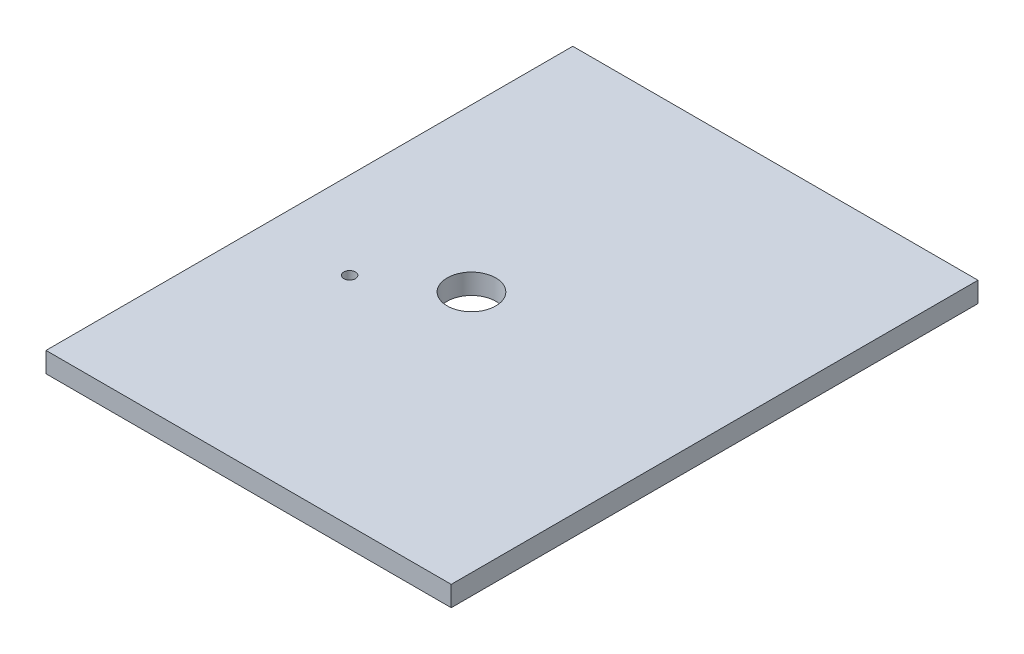
ISO-10303-21;
HEADER;
FILE_DESCRIPTION(('STEP AP214'),'2;1');
FILE_NAME('part.step','',(''),(''),'','','');
FILE_SCHEMA(('AUTOMOTIVE_DESIGN { 1 0 10303 214 1 1 1 1 }'));
ENDSEC;
DATA;
#1=APPLICATION_CONTEXT('core data for automotive mechanical design processes');
#2=APPLICATION_PROTOCOL_DEFINITION('international standard','automotive_design',2000,#1);
#3=PRODUCT_CONTEXT('',#1,'mechanical');
#4=PRODUCT('Part','Part','',(#3));
#5=PRODUCT_RELATED_PRODUCT_CATEGORY('part','',(#4));
#6=PRODUCT_DEFINITION_FORMATION('','',#4);
#7=PRODUCT_DEFINITION_CONTEXT('part definition',#1,'design');
#8=PRODUCT_DEFINITION('design','',#6,#7);
#9=PRODUCT_DEFINITION_SHAPE('','',#8);
#10=(LENGTH_UNIT() NAMED_UNIT(*) SI_UNIT(.MILLI.,.METRE.));
#11=(NAMED_UNIT(*) PLANE_ANGLE_UNIT() SI_UNIT($,.RADIAN.));
#12=(NAMED_UNIT(*) SI_UNIT($,.STERADIAN.) SOLID_ANGLE_UNIT());
#13=UNCERTAINTY_MEASURE_WITH_UNIT(LENGTH_MEASURE(1.E-05),#10,'distance_accuracy_value','');
#14=(GEOMETRIC_REPRESENTATION_CONTEXT(3) GLOBAL_UNCERTAINTY_ASSIGNED_CONTEXT((#13)) GLOBAL_UNIT_ASSIGNED_CONTEXT((#10,
#11,#12)) REPRESENTATION_CONTEXT('',''));
#15=CARTESIAN_POINT('',(0.,0.,0.));
#16=DIRECTION('',(0.,0.,1.));
#17=DIRECTION('',(1.,0.,0.));
#18=AXIS2_PLACEMENT_3D('',#15,#16,#17);
#19=CARTESIAN_POINT('',(0.,5.,0.));
#20=DIRECTION('',(0.,1.,0.));
#21=DIRECTION('',(0.,0.,1.));
#22=AXIS2_PLACEMENT_3D('',#19,#20,#21);
#23=PLANE('',#22);
#24=CARTESIAN_POINT('',(13.3490566037736,5.,-39.6462264150943));
#25=DIRECTION('',(0.,1.,0.));
#26=DIRECTION('',(0.,0.,1.));
#27=AXIS2_PLACEMENT_3D('',#24,#25,#26);
#28=CIRCLE('',#27,6.00000000000001);
#29=CARTESIAN_POINT('',(13.3490566037736,5.,-33.6462264150943));
#30=VERTEX_POINT('',#29);
#31=EDGE_CURVE('E100',#30,#30,#28,.T.);
#32=ORIENTED_EDGE('',*,*,#31,.F.);
#33=EDGE_LOOP('',(#32));
#34=FACE_BOUND('',#33,.T.);
#35=DIRECTION('',(0.,0.,1.));
#36=VECTOR('',#35,1.);
#37=CARTESIAN_POINT('',(-26.6509433962264,5.,-104.646226415094));
#38=LINE('',#37,#36);
#39=CARTESIAN_POINT('',(-26.6509433962264,5.,-104.646226415094));
#40=VERTEX_POINT('',#39);
#41=CARTESIAN_POINT('',(-26.6509433962264,5.,25.3537735849057));
#42=VERTEX_POINT('',#41);
#43=EDGE_CURVE('E85',#40,#42,#38,.T.);
#44=ORIENTED_EDGE('',*,*,#43,.T.);
#45=DIRECTION('',(1.,0.,0.));
#46=VECTOR('',#45,1.);
#47=CARTESIAN_POINT('',(-26.6509433962264,5.,25.3537735849057));
#48=LINE('',#47,#46);
#49=CARTESIAN_POINT('',(73.3490566037736,5.,25.3537735849057));
#50=VERTEX_POINT('',#49);
#51=EDGE_CURVE('E80',#42,#50,#48,.T.);
#52=ORIENTED_EDGE('',*,*,#51,.T.);
#53=DIRECTION('',(0.,0.,-1.));
#54=VECTOR('',#53,1.);
#55=CARTESIAN_POINT('',(73.3490566037736,5.,-104.646226415094));
#56=LINE('',#55,#54);
#57=CARTESIAN_POINT('',(73.3490566037736,5.,-104.646226415094));
#58=VERTEX_POINT('',#57);
#59=EDGE_CURVE('E83',#50,#58,#56,.T.);
#60=ORIENTED_EDGE('',*,*,#59,.T.);
#61=DIRECTION('',(-1.,0.,0.));
#62=VECTOR('',#61,1.);
#63=CARTESIAN_POINT('',(-26.6509433962264,5.,-104.646226415094));
#64=LINE('',#63,#62);
#65=EDGE_CURVE('E50',#58,#40,#64,.T.);
#66=ORIENTED_EDGE('',*,*,#65,.T.);
#67=EDGE_LOOP('',(#44,#52,#60,#66));
#68=FACE_BOUND('',#67,.T.);
#69=CARTESIAN_POINT('',(-5.23521012000572,5.,-28.1656975526831));
#70=DIRECTION('',(0.,1.,0.));
#71=DIRECTION('',(0.,0.,1.));
#72=AXIS2_PLACEMENT_3D('',#69,#70,#71);
#73=CIRCLE('',#72,1.44417410897771);
#74=CARTESIAN_POINT('',(-5.23521012000572,5.,-26.7215234437054));
#75=VERTEX_POINT('',#74);
#76=EDGE_CURVE('E115',#75,#75,#73,.T.);
#77=ORIENTED_EDGE('',*,*,#76,.F.);
#78=EDGE_LOOP('',(#77));
#79=FACE_BOUND('',#78,.T.);
#80=ADVANCED_FACE('F33',(#34,#68,#79),#23,.T.);
#81=CARTESIAN_POINT('',(0.,0.,0.));
#82=DIRECTION('',(0.,1.,0.));
#83=DIRECTION('',(0.,0.,1.));
#84=AXIS2_PLACEMENT_3D('',#81,#82,#83);
#85=PLANE('',#84);
#86=DIRECTION('',(0.,0.,1.));
#87=VECTOR('',#86,1.);
#88=CARTESIAN_POINT('',(-26.6509433962264,0.,-104.646226415094));
#89=LINE('',#88,#87);
#90=CARTESIAN_POINT('',(-26.6509433962264,0.,-104.646226415094));
#91=VERTEX_POINT('',#90);
#92=CARTESIAN_POINT('',(-26.6509433962264,0.,25.3537735849057));
#93=VERTEX_POINT('',#92);
#94=EDGE_CURVE('E97',#91,#93,#89,.T.);
#95=ORIENTED_EDGE('',*,*,#94,.F.);
#96=DIRECTION('',(-1.,0.,0.));
#97=VECTOR('',#96,1.);
#98=CARTESIAN_POINT('',(-26.6509433962264,0.,-104.646226415094));
#99=LINE('',#98,#97);
#100=CARTESIAN_POINT('',(73.3490566037736,0.,-104.646226415094));
#101=VERTEX_POINT('',#100);
#102=EDGE_CURVE('E73',#101,#91,#99,.T.);
#103=ORIENTED_EDGE('',*,*,#102,.F.);
#104=DIRECTION('',(0.,0.,-1.));
#105=VECTOR('',#104,1.);
#106=CARTESIAN_POINT('',(73.3490566037736,0.,-104.646226415094));
#107=LINE('',#106,#105);
#108=CARTESIAN_POINT('',(73.3490566037736,0.,25.3537735849057));
#109=VERTEX_POINT('',#108);
#110=EDGE_CURVE('E67',#109,#101,#107,.T.);
#111=ORIENTED_EDGE('',*,*,#110,.F.);
#112=DIRECTION('',(1.,0.,0.));
#113=VECTOR('',#112,1.);
#114=CARTESIAN_POINT('',(-26.6509433962264,0.,25.3537735849057));
#115=LINE('',#114,#113);
#116=EDGE_CURVE('E89',#93,#109,#115,.T.);
#117=ORIENTED_EDGE('',*,*,#116,.F.);
#118=EDGE_LOOP('',(#95,#103,#111,#117));
#119=FACE_BOUND('',#118,.T.);
#120=CARTESIAN_POINT('',(13.3490566037736,0.,-39.6462264150943));
#121=DIRECTION('',(0.,1.,0.));
#122=DIRECTION('',(0.,0.,1.));
#123=AXIS2_PLACEMENT_3D('',#120,#121,#122);
#124=CIRCLE('',#123,6.00000000000001);
#125=CARTESIAN_POINT('',(13.3490566037736,0.,-33.6462264150943));
#126=VERTEX_POINT('',#125);
#127=EDGE_CURVE('E112',#126,#126,#124,.T.);
#128=ORIENTED_EDGE('',*,*,#127,.T.);
#129=EDGE_LOOP('',(#128));
#130=FACE_BOUND('',#129,.T.);
#131=CARTESIAN_POINT('',(-5.23521012000572,0.,-28.1656975526831));
#132=DIRECTION('',(0.,1.,0.));
#133=DIRECTION('',(0.,0.,1.));
#134=AXIS2_PLACEMENT_3D('',#131,#132,#133);
#135=CIRCLE('',#134,1.44417410897771);
#136=CARTESIAN_POINT('',(-5.23521012000572,0.,-26.7215234437054));
#137=VERTEX_POINT('',#136);
#138=EDGE_CURVE('E118',#137,#137,#135,.T.);
#139=ORIENTED_EDGE('',*,*,#138,.T.);
#140=EDGE_LOOP('',(#139));
#141=FACE_BOUND('',#140,.T.);
#142=ADVANCED_FACE('F108',(#119,#130,#141),#85,.F.);
#143=CARTESIAN_POINT('',(-26.6509433962264,5.,-104.646226415094));
#144=DIRECTION('',(1.,0.,0.));
#145=DIRECTION('',(0.,0.,-1.));
#146=AXIS2_PLACEMENT_3D('',#143,#144,#145);
#147=PLANE('',#146);
#148=ORIENTED_EDGE('',*,*,#94,.T.);
#149=DIRECTION('',(0.,-1.,0.));
#150=VECTOR('',#149,1.);
#151=CARTESIAN_POINT('',(-26.6509433962264,5.,25.3537735849057));
#152=LINE('',#151,#150);
#153=EDGE_CURVE('E11',#42,#93,#152,.T.);
#154=ORIENTED_EDGE('',*,*,#153,.F.);
#155=ORIENTED_EDGE('',*,*,#43,.F.);
#156=DIRECTION('',(0.,-1.,0.));
#157=VECTOR('',#156,1.);
#158=CARTESIAN_POINT('',(-26.6509433962264,5.,-104.646226415094));
#159=LINE('',#158,#157);
#160=EDGE_CURVE('E93',#40,#91,#159,.T.);
#161=ORIENTED_EDGE('',*,*,#160,.T.);
#162=EDGE_LOOP('',(#148,#154,#155,#161));
#163=FACE_BOUND('',#162,.T.);
#164=ADVANCED_FACE('F35',(#163),#147,.F.);
#165=CARTESIAN_POINT('',(-26.6509433962264,5.,25.3537735849057));
#166=DIRECTION('',(0.,0.,-1.));
#167=DIRECTION('',(-1.,0.,0.));
#168=AXIS2_PLACEMENT_3D('',#165,#166,#167);
#169=PLANE('',#168);
#170=ORIENTED_EDGE('',*,*,#116,.T.);
#171=DIRECTION('',(0.,-1.,0.));
#172=VECTOR('',#171,1.);
#173=CARTESIAN_POINT('',(73.3490566037736,5.,25.3537735849057));
#174=LINE('',#173,#172);
#175=EDGE_CURVE('E42',#50,#109,#174,.T.);
#176=ORIENTED_EDGE('',*,*,#175,.F.);
#177=ORIENTED_EDGE('',*,*,#51,.F.);
#178=ORIENTED_EDGE('',*,*,#153,.T.);
#179=EDGE_LOOP('',(#170,#176,#177,#178));
#180=FACE_BOUND('',#179,.T.);
#181=ADVANCED_FACE('F88',(#180),#169,.F.);
#182=CARTESIAN_POINT('',(73.3490566037736,5.,-104.646226415094));
#183=DIRECTION('',(-1.,0.,0.));
#184=DIRECTION('',(0.,0.,1.));
#185=AXIS2_PLACEMENT_3D('',#182,#183,#184);
#186=PLANE('',#185);
#187=ORIENTED_EDGE('',*,*,#110,.T.);
#188=DIRECTION('',(0.,-1.,0.));
#189=VECTOR('',#188,1.);
#190=CARTESIAN_POINT('',(73.3490566037736,5.,-104.646226415094));
#191=LINE('',#190,#189);
#192=EDGE_CURVE('E90',#58,#101,#191,.T.);
#193=ORIENTED_EDGE('',*,*,#192,.F.);
#194=ORIENTED_EDGE('',*,*,#59,.F.);
#195=ORIENTED_EDGE('',*,*,#175,.T.);
#196=EDGE_LOOP('',(#187,#193,#194,#195));
#197=FACE_BOUND('',#196,.T.);
#198=ADVANCED_FACE('F91',(#197),#186,.F.);
#199=CARTESIAN_POINT('',(-26.6509433962264,5.,-104.646226415094));
#200=DIRECTION('',(0.,0.,1.));
#201=DIRECTION('',(1.,0.,0.));
#202=AXIS2_PLACEMENT_3D('',#199,#200,#201);
#203=PLANE('',#202);
#204=ORIENTED_EDGE('',*,*,#102,.T.);
#205=ORIENTED_EDGE('',*,*,#160,.F.);
#206=ORIENTED_EDGE('',*,*,#65,.F.);
#207=ORIENTED_EDGE('',*,*,#192,.T.);
#208=EDGE_LOOP('',(#204,#205,#206,#207));
#209=FACE_BOUND('',#208,.T.);
#210=ADVANCED_FACE('F105',(#209),#203,.F.);
#211=CARTESIAN_POINT('',(13.3490566037736,5.,-39.6462264150943));
#212=DIRECTION('',(0.,-1.,0.));
#213=DIRECTION('',(0.,0.,-1.));
#214=AXIS2_PLACEMENT_3D('',#211,#212,#213);
#215=CYLINDRICAL_SURFACE('',#214,6.00000000000001);
#216=ORIENTED_EDGE('',*,*,#31,.T.);
#217=EDGE_LOOP('',(#216));
#218=FACE_BOUND('',#217,.T.);
#219=ORIENTED_EDGE('',*,*,#127,.F.);
#220=EDGE_LOOP('',(#219));
#221=FACE_BOUND('',#220,.T.);
#222=ADVANCED_FACE('F135',(#218,#221),#215,.F.);
#223=CARTESIAN_POINT('',(-5.23521012000572,5.,-28.1656975526831));
#224=DIRECTION('',(0.,-1.,0.));
#225=DIRECTION('',(0.,0.,-1.));
#226=AXIS2_PLACEMENT_3D('',#223,#224,#225);
#227=CYLINDRICAL_SURFACE('',#226,1.44417410897771);
#228=ORIENTED_EDGE('',*,*,#76,.T.);
#229=EDGE_LOOP('',(#228));
#230=FACE_BOUND('',#229,.T.);
#231=ORIENTED_EDGE('',*,*,#138,.F.);
#232=EDGE_LOOP('',(#231));
#233=FACE_BOUND('',#232,.T.);
#234=ADVANCED_FACE('F124',(#230,#233),#227,.F.);
#235=CLOSED_SHELL('',(#80,#142,#164,#181,#198,#210,#222,#234));
#236=MANIFOLD_SOLID_BREP('B2',#235);
#237=ADVANCED_BREP_SHAPE_REPRESENTATION('',(#18,#236),#14);
#238=SHAPE_DEFINITION_REPRESENTATION(#9,#237);
ENDSEC;
END-ISO-10303-21;
